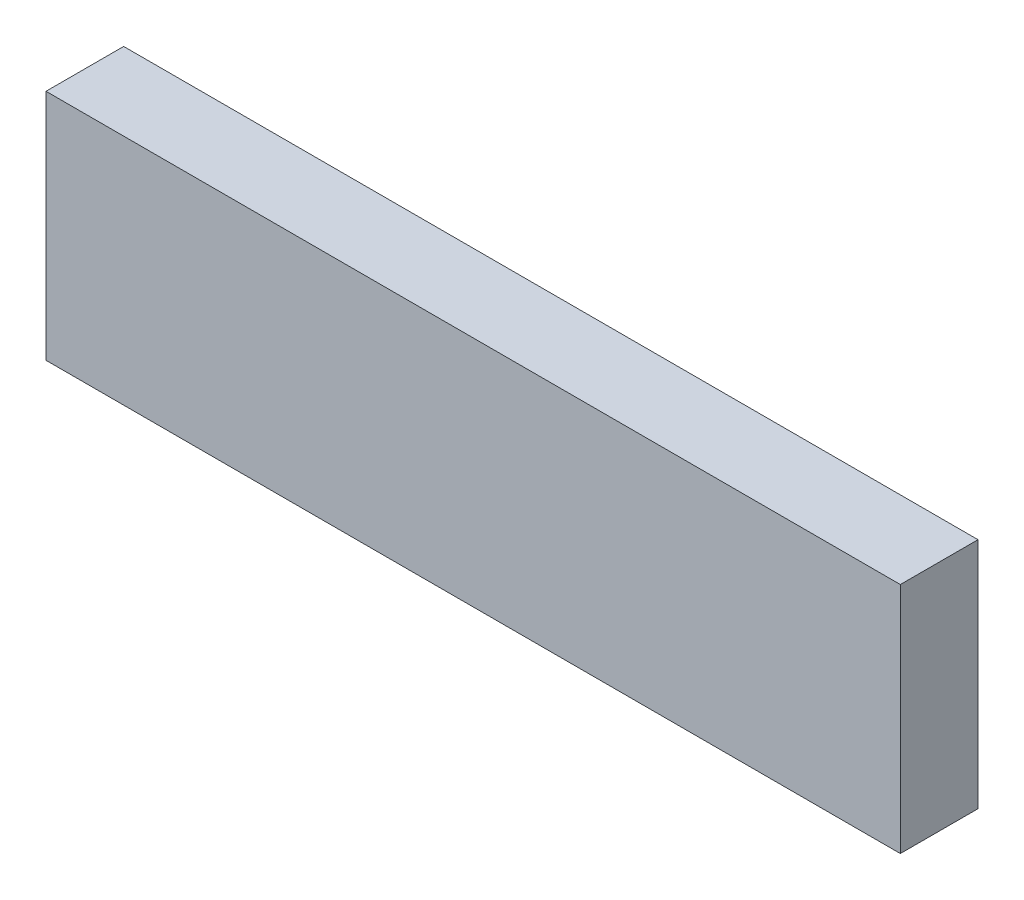
ISO-10303-21;
HEADER;
FILE_DESCRIPTION(('STEP AP214'),'2;1');
FILE_NAME('part.step','',(''),(''),'','','');
FILE_SCHEMA(('AUTOMOTIVE_DESIGN { 1 0 10303 214 1 1 1 1 }'));
ENDSEC;
DATA;
#1=APPLICATION_CONTEXT('core data for automotive mechanical design processes');
#2=APPLICATION_PROTOCOL_DEFINITION('international standard','automotive_design',2000,#1);
#3=PRODUCT_CONTEXT('',#1,'mechanical');
#4=PRODUCT('Part','Part','',(#3));
#5=PRODUCT_RELATED_PRODUCT_CATEGORY('part','',(#4));
#6=PRODUCT_DEFINITION_FORMATION('','',#4);
#7=PRODUCT_DEFINITION_CONTEXT('part definition',#1,'design');
#8=PRODUCT_DEFINITION('design','',#6,#7);
#9=PRODUCT_DEFINITION_SHAPE('','',#8);
#10=(LENGTH_UNIT() NAMED_UNIT(*) SI_UNIT(.MILLI.,.METRE.));
#11=(NAMED_UNIT(*) PLANE_ANGLE_UNIT() SI_UNIT($,.RADIAN.));
#12=(NAMED_UNIT(*) SI_UNIT($,.STERADIAN.) SOLID_ANGLE_UNIT());
#13=UNCERTAINTY_MEASURE_WITH_UNIT(LENGTH_MEASURE(1.E-05),#10,'distance_accuracy_value','');
#14=(GEOMETRIC_REPRESENTATION_CONTEXT(3) GLOBAL_UNCERTAINTY_ASSIGNED_CONTEXT((#13)) GLOBAL_UNIT_ASSIGNED_CONTEXT((#10,
#11,#12)) REPRESENTATION_CONTEXT('',''));
#15=CARTESIAN_POINT('',(0.,0.,0.));
#16=DIRECTION('',(0.,0.,1.));
#17=DIRECTION('',(1.,0.,0.));
#18=AXIS2_PLACEMENT_3D('',#15,#16,#17);
#19=CARTESIAN_POINT('',(55.,15.,-10.));
#20=DIRECTION('',(1.,0.,0.));
#21=DIRECTION('',(0.,0.,-1.));
#22=AXIS2_PLACEMENT_3D('',#19,#20,#21);
#23=PLANE('',#22);
#24=DIRECTION('',(0.,1.,0.));
#25=VECTOR('',#24,1.);
#26=CARTESIAN_POINT('',(55.,15.,0.));
#27=LINE('',#26,#25);
#28=CARTESIAN_POINT('',(55.,-15.,0.));
#29=VERTEX_POINT('',#28);
#30=CARTESIAN_POINT('',(55.,15.,0.));
#31=VERTEX_POINT('',#30);
#32=EDGE_CURVE('E101',#29,#31,#27,.T.);
#33=ORIENTED_EDGE('',*,*,#32,.F.);
#34=DIRECTION('',(0.,0.,1.));
#35=VECTOR('',#34,1.);
#36=CARTESIAN_POINT('',(55.,-15.,-10.));
#37=LINE('',#36,#35);
#38=CARTESIAN_POINT('',(55.,-15.,-10.));
#39=VERTEX_POINT('',#38);
#40=EDGE_CURVE('E11',#39,#29,#37,.T.);
#41=ORIENTED_EDGE('',*,*,#40,.F.);
#42=DIRECTION('',(0.,1.,0.));
#43=VECTOR('',#42,1.);
#44=CARTESIAN_POINT('',(55.,15.,-10.));
#45=LINE('',#44,#43);
#46=CARTESIAN_POINT('',(55.,15.,-10.));
#47=VERTEX_POINT('',#46);
#48=EDGE_CURVE('E95',#39,#47,#45,.T.);
#49=ORIENTED_EDGE('',*,*,#48,.T.);
#50=DIRECTION('',(0.,0.,1.));
#51=VECTOR('',#50,1.);
#52=CARTESIAN_POINT('',(55.,15.,-10.));
#53=LINE('',#52,#51);
#54=EDGE_CURVE('E40',#47,#31,#53,.T.);
#55=ORIENTED_EDGE('',*,*,#54,.T.);
#56=EDGE_LOOP('',(#33,#41,#49,#55));
#57=FACE_BOUND('',#56,.T.);
#58=ADVANCED_FACE('F37',(#57),#23,.T.);
#59=CARTESIAN_POINT('',(-55.,-15.,-10.));
#60=DIRECTION('',(0.,-1.,0.));
#61=DIRECTION('',(0.,0.,-1.));
#62=AXIS2_PLACEMENT_3D('',#59,#60,#61);
#63=PLANE('',#62);
#64=DIRECTION('',(1.,0.,0.));
#65=VECTOR('',#64,1.);
#66=CARTESIAN_POINT('',(-55.,-15.,0.));
#67=LINE('',#66,#65);
#68=CARTESIAN_POINT('',(-55.,-15.,0.));
#69=VERTEX_POINT('',#68);
#70=EDGE_CURVE('E97',#69,#29,#67,.T.);
#71=ORIENTED_EDGE('',*,*,#70,.F.);
#72=DIRECTION('',(0.,0.,1.));
#73=VECTOR('',#72,1.);
#74=CARTESIAN_POINT('',(-55.,-15.,-10.));
#75=LINE('',#74,#73);
#76=CARTESIAN_POINT('',(-55.,-15.,-10.));
#77=VERTEX_POINT('',#76);
#78=EDGE_CURVE('E46',#77,#69,#75,.T.);
#79=ORIENTED_EDGE('',*,*,#78,.F.);
#80=DIRECTION('',(1.,0.,0.));
#81=VECTOR('',#80,1.);
#82=CARTESIAN_POINT('',(-55.,-15.,-10.));
#83=LINE('',#82,#81);
#84=EDGE_CURVE('E92',#77,#39,#83,.T.);
#85=ORIENTED_EDGE('',*,*,#84,.T.);
#86=ORIENTED_EDGE('',*,*,#40,.T.);
#87=EDGE_LOOP('',(#71,#79,#85,#86));
#88=FACE_BOUND('',#87,.T.);
#89=ADVANCED_FACE('F111',(#88),#63,.T.);
#90=CARTESIAN_POINT('',(-55.,15.,-10.));
#91=DIRECTION('',(-1.,0.,0.));
#92=DIRECTION('',(0.,0.,1.));
#93=AXIS2_PLACEMENT_3D('',#90,#91,#92);
#94=PLANE('',#93);
#95=DIRECTION('',(0.,-1.,0.));
#96=VECTOR('',#95,1.);
#97=CARTESIAN_POINT('',(-55.,15.,0.));
#98=LINE('',#97,#96);
#99=CARTESIAN_POINT('',(-55.,15.,0.));
#100=VERTEX_POINT('',#99);
#101=EDGE_CURVE('E87',#100,#69,#98,.T.);
#102=ORIENTED_EDGE('',*,*,#101,.F.);
#103=DIRECTION('',(0.,0.,1.));
#104=VECTOR('',#103,1.);
#105=CARTESIAN_POINT('',(-55.,15.,-10.));
#106=LINE('',#105,#104);
#107=CARTESIAN_POINT('',(-55.,15.,-10.));
#108=VERTEX_POINT('',#107);
#109=EDGE_CURVE('E82',#108,#100,#106,.T.);
#110=ORIENTED_EDGE('',*,*,#109,.F.);
#111=DIRECTION('',(0.,-1.,0.));
#112=VECTOR('',#111,1.);
#113=CARTESIAN_POINT('',(-55.,15.,-10.));
#114=LINE('',#113,#112);
#115=EDGE_CURVE('E85',#108,#77,#114,.T.);
#116=ORIENTED_EDGE('',*,*,#115,.T.);
#117=ORIENTED_EDGE('',*,*,#78,.T.);
#118=EDGE_LOOP('',(#102,#110,#116,#117));
#119=FACE_BOUND('',#118,.T.);
#120=ADVANCED_FACE('F84',(#119),#94,.T.);
#121=CARTESIAN_POINT('',(-55.,15.,-10.));
#122=DIRECTION('',(0.,1.,0.));
#123=DIRECTION('',(0.,0.,1.));
#124=AXIS2_PLACEMENT_3D('',#121,#122,#123);
#125=PLANE('',#124);
#126=DIRECTION('',(-1.,0.,0.));
#127=VECTOR('',#126,1.);
#128=CARTESIAN_POINT('',(-55.,15.,0.));
#129=LINE('',#128,#127);
#130=EDGE_CURVE('E104',#31,#100,#129,.T.);
#131=ORIENTED_EDGE('',*,*,#130,.F.);
#132=ORIENTED_EDGE('',*,*,#54,.F.);
#133=DIRECTION('',(-1.,0.,0.));
#134=VECTOR('',#133,1.);
#135=CARTESIAN_POINT('',(-55.,15.,-10.));
#136=LINE('',#135,#134);
#137=EDGE_CURVE('E91',#47,#108,#136,.T.);
#138=ORIENTED_EDGE('',*,*,#137,.T.);
#139=ORIENTED_EDGE('',*,*,#109,.T.);
#140=EDGE_LOOP('',(#131,#132,#138,#139));
#141=FACE_BOUND('',#140,.T.);
#142=ADVANCED_FACE('F94',(#141),#125,.T.);
#143=CARTESIAN_POINT('',(0.,0.,-10.));
#144=DIRECTION('',(0.,0.,1.));
#145=DIRECTION('',(1.,0.,0.));
#146=AXIS2_PLACEMENT_3D('',#143,#144,#145);
#147=PLANE('',#146);
#148=ORIENTED_EDGE('',*,*,#48,.F.);
#149=ORIENTED_EDGE('',*,*,#84,.F.);
#150=ORIENTED_EDGE('',*,*,#115,.F.);
#151=ORIENTED_EDGE('',*,*,#137,.F.);
#152=EDGE_LOOP('',(#148,#149,#150,#151));
#153=FACE_BOUND('',#152,.T.);
#154=ADVANCED_FACE('F90',(#153),#147,.F.);
#155=CARTESIAN_POINT('',(0.,0.,0.));
#156=DIRECTION('',(0.,0.,1.));
#157=DIRECTION('',(1.,0.,0.));
#158=AXIS2_PLACEMENT_3D('',#155,#156,#157);
#159=PLANE('',#158);
#160=ORIENTED_EDGE('',*,*,#32,.T.);
#161=ORIENTED_EDGE('',*,*,#130,.T.);
#162=ORIENTED_EDGE('',*,*,#101,.T.);
#163=ORIENTED_EDGE('',*,*,#70,.T.);
#164=EDGE_LOOP('',(#160,#161,#162,#163));
#165=FACE_BOUND('',#164,.T.);
#166=ADVANCED_FACE('F110',(#165),#159,.T.);
#167=CLOSED_SHELL('',(#58,#89,#120,#142,#154,#166));
#168=MANIFOLD_SOLID_BREP('B2',#167);
#169=ADVANCED_BREP_SHAPE_REPRESENTATION('',(#18,#168),#14);
#170=SHAPE_DEFINITION_REPRESENTATION(#9,#169);
ENDSEC;
END-ISO-10303-21;
